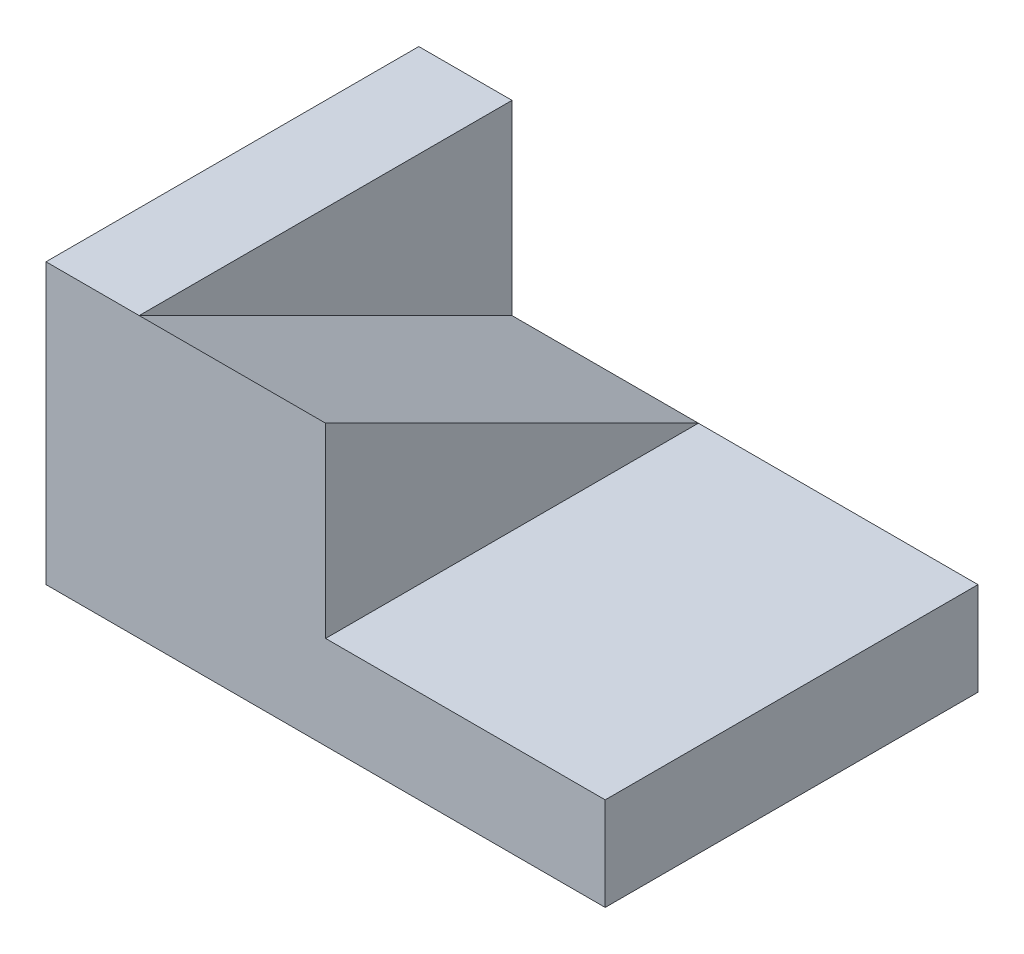
ISO-10303-21;
HEADER;
FILE_DESCRIPTION(('STEP AP214'),'2;1');
FILE_NAME('part.step','',(''),(''),'','','');
FILE_SCHEMA(('AUTOMOTIVE_DESIGN { 1 0 10303 214 1 1 1 1 }'));
ENDSEC;
DATA;
#1=APPLICATION_CONTEXT('core data for automotive mechanical design processes');
#2=APPLICATION_PROTOCOL_DEFINITION('international standard','automotive_design',2000,#1);
#3=PRODUCT_CONTEXT('',#1,'mechanical');
#4=PRODUCT('Part','Part','',(#3));
#5=PRODUCT_RELATED_PRODUCT_CATEGORY('part','',(#4));
#6=PRODUCT_DEFINITION_FORMATION('','',#4);
#7=PRODUCT_DEFINITION_CONTEXT('part definition',#1,'design');
#8=PRODUCT_DEFINITION('design','',#6,#7);
#9=PRODUCT_DEFINITION_SHAPE('','',#8);
#10=(LENGTH_UNIT() NAMED_UNIT(*) SI_UNIT(.MILLI.,.METRE.));
#11=(NAMED_UNIT(*) PLANE_ANGLE_UNIT() SI_UNIT($,.RADIAN.));
#12=(NAMED_UNIT(*) SI_UNIT($,.STERADIAN.) SOLID_ANGLE_UNIT());
#13=UNCERTAINTY_MEASURE_WITH_UNIT(LENGTH_MEASURE(1.E-05),#10,'distance_accuracy_value','');
#14=(GEOMETRIC_REPRESENTATION_CONTEXT(3) GLOBAL_UNCERTAINTY_ASSIGNED_CONTEXT((#13)) GLOBAL_UNIT_ASSIGNED_CONTEXT((#10,
#11,#12)) REPRESENTATION_CONTEXT('',''));
#15=CARTESIAN_POINT('',(0.,0.,0.));
#16=DIRECTION('',(0.,0.,1.));
#17=DIRECTION('',(1.,0.,0.));
#18=AXIS2_PLACEMENT_3D('',#15,#16,#17);
#19=CARTESIAN_POINT('',(10.,0.,-40.));
#20=DIRECTION('',(0.,0.,1.));
#21=DIRECTION('',(0.,-1.,0.));
#22=AXIS2_PLACEMENT_3D('',#19,#20,#21);
#23=PLANE('',#22);
#24=DIRECTION('',(0.,1.,0.));
#25=VECTOR('',#24,1.);
#26=CARTESIAN_POINT('',(10.,0.,-40.));
#27=LINE('',#26,#25);
#28=CARTESIAN_POINT('',(10.,10.,-40.));
#29=VERTEX_POINT('',#28);
#30=CARTESIAN_POINT('',(10.,30.,-40.));
#31=VERTEX_POINT('',#30);
#32=EDGE_CURVE('E88',#29,#31,#27,.T.);
#33=ORIENTED_EDGE('',*,*,#32,.F.);
#34=DIRECTION('',(-1.,0.,0.));
#35=VECTOR('',#34,1.);
#36=CARTESIAN_POINT('',(30.,10.,-40.));
#37=LINE('',#36,#35);
#38=CARTESIAN_POINT('',(30.,10.,-40.));
#39=VERTEX_POINT('',#38);
#40=EDGE_CURVE('E129',#39,#29,#37,.T.);
#41=ORIENTED_EDGE('',*,*,#40,.F.);
#42=DIRECTION('',(-1.,0.,0.));
#43=VECTOR('',#42,1.);
#44=CARTESIAN_POINT('',(60.,10.,-40.));
#45=LINE('',#44,#43);
#46=CARTESIAN_POINT('',(60.,10.,-40.));
#47=VERTEX_POINT('',#46);
#48=EDGE_CURVE('E106',#47,#39,#45,.T.);
#49=ORIENTED_EDGE('',*,*,#48,.F.);
#50=DIRECTION('',(0.,1.,0.));
#51=VECTOR('',#50,1.);
#52=CARTESIAN_POINT('',(60.,0.,-40.));
#53=LINE('',#52,#51);
#54=CARTESIAN_POINT('',(60.,0.,-40.));
#55=VERTEX_POINT('',#54);
#56=EDGE_CURVE('E99',#55,#47,#53,.T.);
#57=ORIENTED_EDGE('',*,*,#56,.F.);
#58=DIRECTION('',(-1.,0.,0.));
#59=VECTOR('',#58,1.);
#60=CARTESIAN_POINT('',(10.,0.,-40.));
#61=LINE('',#60,#59);
#62=CARTESIAN_POINT('',(0.,0.,-40.));
#63=VERTEX_POINT('',#62);
#64=EDGE_CURVE('E81',#55,#63,#61,.T.);
#65=ORIENTED_EDGE('',*,*,#64,.T.);
#66=DIRECTION('',(0.,1.,0.));
#67=VECTOR('',#66,1.);
#68=CARTESIAN_POINT('',(0.,0.,-40.));
#69=LINE('',#68,#67);
#70=CARTESIAN_POINT('',(0.,30.,-40.));
#71=VERTEX_POINT('',#70);
#72=EDGE_CURVE('E95',#63,#71,#69,.T.);
#73=ORIENTED_EDGE('',*,*,#72,.T.);
#74=DIRECTION('',(-1.,0.,0.));
#75=VECTOR('',#74,1.);
#76=CARTESIAN_POINT('',(10.,30.,-40.));
#77=LINE('',#76,#75);
#78=EDGE_CURVE('E11',#31,#71,#77,.T.);
#79=ORIENTED_EDGE('',*,*,#78,.F.);
#80=EDGE_LOOP('',(#33,#41,#49,#57,#65,#73,#79));
#81=FACE_BOUND('',#80,.T.);
#82=ADVANCED_FACE('F33',(#81),#23,.F.);
#83=CARTESIAN_POINT('',(10.,30.,0.));
#84=DIRECTION('',(0.,-1.,0.));
#85=DIRECTION('',(0.,0.,-1.));
#86=AXIS2_PLACEMENT_3D('',#83,#84,#85);
#87=PLANE('',#86);
#88=DIRECTION('',(0.,0.,1.));
#89=VECTOR('',#88,1.);
#90=CARTESIAN_POINT('',(0.,30.,0.));
#91=LINE('',#90,#89);
#92=CARTESIAN_POINT('',(0.,30.,0.));
#93=VERTEX_POINT('',#92);
#94=EDGE_CURVE('E102',#71,#93,#91,.T.);
#95=ORIENTED_EDGE('',*,*,#94,.T.);
#96=DIRECTION('',(-1.,0.,0.));
#97=VECTOR('',#96,1.);
#98=CARTESIAN_POINT('',(10.,30.,0.));
#99=LINE('',#98,#97);
#100=CARTESIAN_POINT('',(10.,30.,0.));
#101=VERTEX_POINT('',#100);
#102=EDGE_CURVE('E40',#101,#93,#99,.T.);
#103=ORIENTED_EDGE('',*,*,#102,.F.);
#104=DIRECTION('',(0.,0.,1.));
#105=VECTOR('',#104,1.);
#106=CARTESIAN_POINT('',(10.,30.,0.));
#107=LINE('',#106,#105);
#108=EDGE_CURVE('E56',#31,#101,#107,.T.);
#109=ORIENTED_EDGE('',*,*,#108,.F.);
#110=ORIENTED_EDGE('',*,*,#78,.T.);
#111=EDGE_LOOP('',(#95,#103,#109,#110));
#112=FACE_BOUND('',#111,.T.);
#113=ADVANCED_FACE('F121',(#112),#87,.F.);
#114=CARTESIAN_POINT('',(10.,0.,0.));
#115=DIRECTION('',(0.,0.,-1.));
#116=DIRECTION('',(0.,1.,0.));
#117=AXIS2_PLACEMENT_3D('',#114,#115,#116);
#118=PLANE('',#117);
#119=DIRECTION('',(0.,-1.,0.));
#120=VECTOR('',#119,1.);
#121=CARTESIAN_POINT('',(0.,0.,0.));
#122=LINE('',#121,#120);
#123=CARTESIAN_POINT('',(0.,0.,0.));
#124=VERTEX_POINT('',#123);
#125=EDGE_CURVE('E89',#93,#124,#122,.T.);
#126=ORIENTED_EDGE('',*,*,#125,.T.);
#127=DIRECTION('',(-1.,0.,0.));
#128=VECTOR('',#127,1.);
#129=CARTESIAN_POINT('',(10.,0.,0.));
#130=LINE('',#129,#128);
#131=CARTESIAN_POINT('',(60.,0.,0.));
#132=VERTEX_POINT('',#131);
#133=EDGE_CURVE('E84',#132,#124,#130,.T.);
#134=ORIENTED_EDGE('',*,*,#133,.F.);
#135=DIRECTION('',(0.,-1.,0.));
#136=VECTOR('',#135,1.);
#137=CARTESIAN_POINT('',(60.,0.,0.));
#138=LINE('',#137,#136);
#139=CARTESIAN_POINT('',(60.,10.,0.));
#140=VERTEX_POINT('',#139);
#141=EDGE_CURVE('E133',#140,#132,#138,.T.);
#142=ORIENTED_EDGE('',*,*,#141,.F.);
#143=DIRECTION('',(-1.,0.,0.));
#144=VECTOR('',#143,1.);
#145=CARTESIAN_POINT('',(60.,10.,0.));
#146=LINE('',#145,#144);
#147=CARTESIAN_POINT('',(30.,10.,0.));
#148=VERTEX_POINT('',#147);
#149=EDGE_CURVE('E103',#140,#148,#146,.T.);
#150=ORIENTED_EDGE('',*,*,#149,.T.);
#151=DIRECTION('',(0.,-1.,0.));
#152=VECTOR('',#151,1.);
#153=CARTESIAN_POINT('',(30.,0.,0.));
#154=LINE('',#153,#152);
#155=CARTESIAN_POINT('',(30.,30.,0.));
#156=VERTEX_POINT('',#155);
#157=EDGE_CURVE('E160',#156,#148,#154,.T.);
#158=ORIENTED_EDGE('',*,*,#157,.F.);
#159=DIRECTION('',(-1.,0.,0.));
#160=VECTOR('',#159,1.);
#161=CARTESIAN_POINT('',(30.,30.,0.));
#162=LINE('',#161,#160);
#163=EDGE_CURVE('E118',#156,#101,#162,.T.);
#164=ORIENTED_EDGE('',*,*,#163,.T.);
#165=ORIENTED_EDGE('',*,*,#102,.T.);
#166=EDGE_LOOP('',(#126,#134,#142,#150,#158,#164,#165));
#167=FACE_BOUND('',#166,.T.);
#168=ADVANCED_FACE('F115',(#167),#118,.F.);
#169=CARTESIAN_POINT('',(10.,0.,0.));
#170=DIRECTION('',(0.,1.,0.));
#171=DIRECTION('',(0.,0.,1.));
#172=AXIS2_PLACEMENT_3D('',#169,#170,#171);
#173=PLANE('',#172);
#174=DIRECTION('',(0.,0.,-1.));
#175=VECTOR('',#174,1.);
#176=CARTESIAN_POINT('',(0.,0.,0.));
#177=LINE('',#176,#175);
#178=EDGE_CURVE('E76',#124,#63,#177,.T.);
#179=ORIENTED_EDGE('',*,*,#178,.T.);
#180=ORIENTED_EDGE('',*,*,#64,.F.);
#181=DIRECTION('',(0.,0.,-1.));
#182=VECTOR('',#181,1.);
#183=CARTESIAN_POINT('',(60.,0.,0.));
#184=LINE('',#183,#182);
#185=EDGE_CURVE('E140',#132,#55,#184,.T.);
#186=ORIENTED_EDGE('',*,*,#185,.F.);
#187=ORIENTED_EDGE('',*,*,#133,.T.);
#188=EDGE_LOOP('',(#179,#180,#186,#187));
#189=FACE_BOUND('',#188,.T.);
#190=ADVANCED_FACE('F78',(#189),#173,.F.);
#191=CARTESIAN_POINT('',(10.,0.,0.));
#192=DIRECTION('',(1.,0.,0.));
#193=DIRECTION('',(0.,0.,-1.));
#194=AXIS2_PLACEMENT_3D('',#191,#192,#193);
#195=PLANE('',#194);
#196=DIRECTION('',(0.,0.447213595499958,0.894427190999916));
#197=VECTOR('',#196,1.);
#198=CARTESIAN_POINT('',(10.,24.,-12.));
#199=LINE('',#198,#197);
#200=EDGE_CURVE('E124',#29,#101,#199,.T.);
#201=ORIENTED_EDGE('',*,*,#200,.F.);
#202=ORIENTED_EDGE('',*,*,#32,.T.);
#203=ORIENTED_EDGE('',*,*,#108,.T.);
#204=EDGE_LOOP('',(#201,#202,#203));
#205=FACE_BOUND('',#204,.T.);
#206=ADVANCED_FACE('F143',(#205),#195,.T.);
#207=CARTESIAN_POINT('',(0.,0.,0.));
#208=DIRECTION('',(1.,0.,0.));
#209=DIRECTION('',(0.,0.,-1.));
#210=AXIS2_PLACEMENT_3D('',#207,#208,#209);
#211=PLANE('',#210);
#212=ORIENTED_EDGE('',*,*,#94,.F.);
#213=ORIENTED_EDGE('',*,*,#72,.F.);
#214=ORIENTED_EDGE('',*,*,#178,.F.);
#215=ORIENTED_EDGE('',*,*,#125,.F.);
#216=EDGE_LOOP('',(#212,#213,#214,#215));
#217=FACE_BOUND('',#216,.T.);
#218=ADVANCED_FACE('F101',(#217),#211,.F.);
#219=CARTESIAN_POINT('',(60.,10.,0.));
#220=DIRECTION('',(0.,1.,0.));
#221=DIRECTION('',(0.,0.,1.));
#222=AXIS2_PLACEMENT_3D('',#219,#220,#221);
#223=PLANE('',#222);
#224=DIRECTION('',(0.,0.,-1.));
#225=VECTOR('',#224,1.);
#226=CARTESIAN_POINT('',(30.,10.,0.));
#227=LINE('',#226,#225);
#228=EDGE_CURVE('E47',#148,#39,#227,.T.);
#229=ORIENTED_EDGE('',*,*,#228,.F.);
#230=ORIENTED_EDGE('',*,*,#149,.F.);
#231=DIRECTION('',(0.,0.,-1.));
#232=VECTOR('',#231,1.);
#233=CARTESIAN_POINT('',(60.,10.,0.));
#234=LINE('',#233,#232);
#235=EDGE_CURVE('E130',#140,#47,#234,.T.);
#236=ORIENTED_EDGE('',*,*,#235,.T.);
#237=ORIENTED_EDGE('',*,*,#48,.T.);
#238=EDGE_LOOP('',(#229,#230,#236,#237));
#239=FACE_BOUND('',#238,.T.);
#240=ADVANCED_FACE('F154',(#239),#223,.T.);
#241=CARTESIAN_POINT('',(60.,0.,0.));
#242=DIRECTION('',(1.,0.,0.));
#243=DIRECTION('',(0.,0.,-1.));
#244=AXIS2_PLACEMENT_3D('',#241,#242,#243);
#245=PLANE('',#244);
#246=ORIENTED_EDGE('',*,*,#235,.F.);
#247=ORIENTED_EDGE('',*,*,#141,.T.);
#248=ORIENTED_EDGE('',*,*,#185,.T.);
#249=ORIENTED_EDGE('',*,*,#56,.T.);
#250=EDGE_LOOP('',(#246,#247,#248,#249));
#251=FACE_BOUND('',#250,.T.);
#252=ADVANCED_FACE('F158',(#251),#245,.T.);
#253=CARTESIAN_POINT('',(30.,24.,-12.));
#254=DIRECTION('',(0.,0.894427190999916,-0.447213595499958));
#255=DIRECTION('',(0.,0.447213595499958,0.894427190999916));
#256=AXIS2_PLACEMENT_3D('',#253,#254,#255);
#257=PLANE('',#256);
#258=ORIENTED_EDGE('',*,*,#40,.T.);
#259=ORIENTED_EDGE('',*,*,#200,.T.);
#260=ORIENTED_EDGE('',*,*,#163,.F.);
#261=DIRECTION('',(0.,-0.447213595499958,-0.894427190999916));
#262=VECTOR('',#261,1.);
#263=CARTESIAN_POINT('',(30.,24.,-12.));
#264=LINE('',#263,#262);
#265=EDGE_CURVE('E164',#156,#39,#264,.T.);
#266=ORIENTED_EDGE('',*,*,#265,.T.);
#267=EDGE_LOOP('',(#258,#259,#260,#266));
#268=FACE_BOUND('',#267,.T.);
#269=ADVANCED_FACE('F125',(#268),#257,.T.);
#270=CARTESIAN_POINT('',(30.,0.,0.));
#271=DIRECTION('',(1.,0.,0.));
#272=DIRECTION('',(0.,0.,-1.));
#273=AXIS2_PLACEMENT_3D('',#270,#271,#272);
#274=PLANE('',#273);
#275=ORIENTED_EDGE('',*,*,#265,.F.);
#276=ORIENTED_EDGE('',*,*,#157,.T.);
#277=ORIENTED_EDGE('',*,*,#228,.T.);
#278=EDGE_LOOP('',(#275,#276,#277));
#279=FACE_BOUND('',#278,.T.);
#280=ADVANCED_FACE('F163',(#279),#274,.T.);
#281=CLOSED_SHELL('',(#82,#113,#168,#190,#206,#218,#240,#252,#269,#280));
#282=MANIFOLD_SOLID_BREP('B2',#281);
#283=ADVANCED_BREP_SHAPE_REPRESENTATION('',(#18,#282),#14);
#284=SHAPE_DEFINITION_REPRESENTATION(#9,#283);
ENDSEC;
END-ISO-10303-21;
